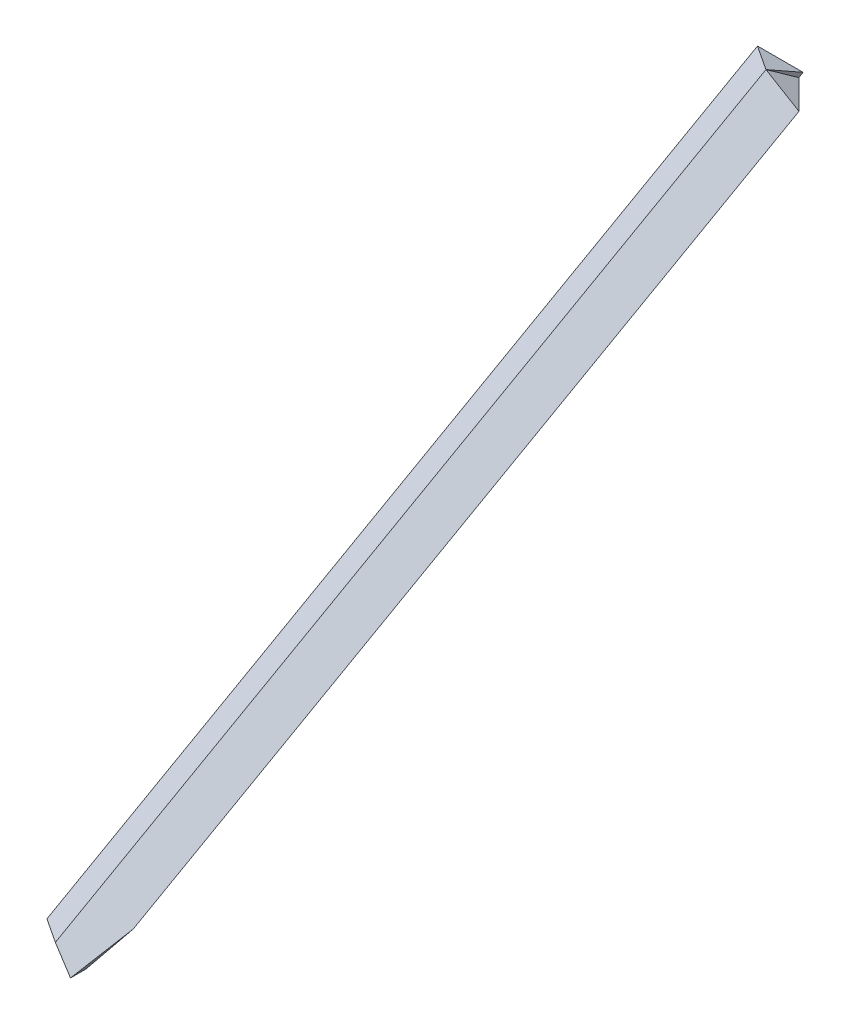
ISO-10303-21;
HEADER;
FILE_DESCRIPTION(('STEP AP214'),'2;1');
FILE_NAME('part.step','',(''),(''),'','','');
FILE_SCHEMA(('AUTOMOTIVE_DESIGN { 1 0 10303 214 1 1 1 1 }'));
ENDSEC;
DATA;
#1=APPLICATION_CONTEXT('core data for automotive mechanical design processes');
#2=APPLICATION_PROTOCOL_DEFINITION('international standard','automotive_design',2000,#1);
#3=PRODUCT_CONTEXT('',#1,'mechanical');
#4=PRODUCT('Part','Part','',(#3));
#5=PRODUCT_RELATED_PRODUCT_CATEGORY('part','',(#4));
#6=PRODUCT_DEFINITION_FORMATION('','',#4);
#7=PRODUCT_DEFINITION_CONTEXT('part definition',#1,'design');
#8=PRODUCT_DEFINITION('design','',#6,#7);
#9=PRODUCT_DEFINITION_SHAPE('','',#8);
#10=(LENGTH_UNIT() NAMED_UNIT(*) SI_UNIT(.MILLI.,.METRE.));
#11=(NAMED_UNIT(*) PLANE_ANGLE_UNIT() SI_UNIT($,.RADIAN.));
#12=(NAMED_UNIT(*) SI_UNIT($,.STERADIAN.) SOLID_ANGLE_UNIT());
#13=UNCERTAINTY_MEASURE_WITH_UNIT(LENGTH_MEASURE(1.E-05),#10,'distance_accuracy_value','');
#14=(GEOMETRIC_REPRESENTATION_CONTEXT(3) GLOBAL_UNCERTAINTY_ASSIGNED_CONTEXT((#13)) GLOBAL_UNIT_ASSIGNED_CONTEXT((#10,
#11,#12)) REPRESENTATION_CONTEXT('',''));
#15=CARTESIAN_POINT('',(0.,0.,0.));
#16=DIRECTION('',(0.,0.,1.));
#17=DIRECTION('',(1.,0.,0.));
#18=AXIS2_PLACEMENT_3D('',#15,#16,#17);
#19=CARTESIAN_POINT('',(252.903016686641,361.646186737307,-51.3842000000199));
#20=DIRECTION('',(-0.599439623726809,0.526033966837768,0.603291308771462));
#21=DIRECTION('',(0.70936761741224,0.,0.704838693153889));
#22=AXIS2_PLACEMENT_3D('',#19,#20,#21);
#23=PLANE('',#22);
#24=DIRECTION('',(0.780329870048942,0.216253771888641,0.586787525475225));
#25=VECTOR('',#24,1.);
#26=CARTESIAN_POINT('',(12.2151255595458,11.1057079121775,15.1149176525535));
#27=LINE('',#26,#25);
#28=CARTESIAN_POINT('',(85.6116867373077,31.4461867373069,70.3072000000032));
#29=VERTEX_POINT('',#28);
#30=CARTESIAN_POINT('',(71.7455888175322,27.6034580508597,59.8802592937195));
#31=VERTEX_POINT('',#30);
#32=EDGE_CURVE('E108',#29,#31,#27,.F.);
#33=ORIENTED_EDGE('',*,*,#32,.F.);
#34=CARTESIAN_POINT('',(252.903016686641,361.646186737307,-51.3842000000199));
#35=CARTESIAN_POINT('',(197.139240036863,251.57952007064,-10.8204000000122));
#36=CARTESIAN_POINT('',(141.375463387085,141.512853403974,29.7433999999955));
#37=CARTESIAN_POINT('',(85.6116867373077,31.4461867373069,70.3072000000032));
#38=B_SPLINE_CURVE_WITH_KNOTS('',3,(#34,#35,#36,#37),.UNSPECIFIED.,.F.,.F.,(4,4),(0.,1.),.UNSPECIFIED.);
#39=CARTESIAN_POINT('',(252.903016686641,361.646186737307,-51.3842000000199));
#40=VERTEX_POINT('',#39);
#41=EDGE_CURVE('E134',#29,#40,#38,.F.);
#42=ORIENTED_EDGE('',*,*,#41,.T.);
#43=DIRECTION('',(0.780329870048942,0.216253771888641,0.586787525475225));
#44=VECTOR('',#43,1.);
#45=CARTESIAN_POINT('',(252.903016686641,361.646186737307,-51.3842000000199));
#46=LINE('',#45,#44);
#47=CARTESIAN_POINT('',(239.036918766865,357.80345805086,-61.8111407063036));
#48=VERTEX_POINT('',#47);
#49=EDGE_CURVE('E136',#48,#40,#46,.T.);
#50=ORIENTED_EDGE('',*,*,#49,.F.);
#51=DIRECTION('',(-0.429337284685995,-0.847426889643666,0.31230940217566));
#52=VECTOR('',#51,1.);
#53=CARTESIAN_POINT('',(241.59286358523,362.848387631368,-63.6703912924742));
#54=LINE('',#53,#52);
#55=EDGE_CURVE('E129',#48,#31,#54,.T.);
#56=ORIENTED_EDGE('',*,*,#55,.T.);
#57=EDGE_LOOP('',(#33,#42,#50,#56));
#58=FACE_BOUND('',#57,.T.);
#59=ADVANCED_FACE('F41',(#58),#23,.T.);
#60=CARTESIAN_POINT('',(-202.216329949319,361.646186737307,-51.3842000000199));
#61=DIRECTION('',(0.,0.345802356485694,0.938307375143637));
#62=DIRECTION('',(0.,-0.938307375143637,0.345802356485694));
#63=AXIS2_PLACEMENT_3D('',#60,#61,#62);
#64=PLANE('',#63);
#65=CARTESIAN_POINT('',(94.3068387159963,24.5265055774754,72.8573686489847));
#66=CARTESIAN_POINT('',(92.8577215480199,25.6798685469874,72.4323100346052));
#67=CARTESIAN_POINT('',(91.4085669647603,26.8331901277958,72.0072666735549));
#68=CARTESIAN_POINT('',(89.2347789699846,28.5631104167612,71.3697245116753));
#69=CARTESIAN_POINT('',(88.5101736171948,29.13974016701,71.1572142706413));
#70=CARTESIAN_POINT('',(87.0609442060382,30.2929789731256,70.7322014152489));
#71=CARTESIAN_POINT('',(86.3363201476714,30.8695880289924,70.5196988008906));
#72=CARTESIAN_POINT('',(85.6116867373077,31.4461867373069,70.3072000000032));
#73=B_SPLINE_CURVE_WITH_KNOTS('',3,(#65,#66,#67,#68,#69,#70,#71,#72),.UNSPECIFIED.,.F.,.F.,(4,2,
2,4),(0.,5.70068011431883,8.55102018105121,11.4013602504243),.UNSPECIFIED.);
#74=CARTESIAN_POINT('',(94.3068387328869,24.5265055640294,72.8573686614481));
#75=VERTEX_POINT('',#74);
#76=EDGE_CURVE('E124',#75,#29,#73,.T.);
#77=ORIENTED_EDGE('',*,*,#76,.F.);
#78=CARTESIAN_POINT('',(94.3068387499259,24.5265055504701,72.8573686589372));
#79=CARTESIAN_POINT('',(95.8849141094393,26.5094885732394,72.1265631464688));
#80=CARTESIAN_POINT('',(97.4629020841278,28.4925328199966,71.395735070606));
#81=CARTESIAN_POINT('',(100.618718991153,32.4587327135383,69.9340378636859));
#82=CARTESIAN_POINT('',(102.196547923491,34.4418883603223,69.2031687326287));
#83=CARTESIAN_POINT('',(105.352062487446,38.4083000239811,67.7413934802753));
#84=CARTESIAN_POINT('',(106.929748119063,40.3915560408559,67.0104873589792));
#85=CARTESIAN_POINT('',(110.084988987867,44.3581594085822,65.5486414563039));
#86=CARTESIAN_POINT('',(111.662544225053,46.3415067594341,64.8177016749245));
#87=CARTESIAN_POINT('',(113.240040710636,48.3248952497502,64.0867467320703));
#88=B_SPLINE_CURVE_WITH_KNOTS('',3,(#78,#79,#80,#81,#82,#83,#84,#85,#86,#87),.UNSPECIFIED.,.F.,
.F.,(4,2,2,2,4),(0.,7.91262167559483,15.8252433143356,23.7378649512406,31.6504866249996),.UNSPECIFIED.);
#89=CARTESIAN_POINT('',(111.755705126176,46.4586721870779,64.7745217084751));
#90=VERTEX_POINT('',#89);
#91=EDGE_CURVE('E140',#75,#90,#88,.T.);
#92=ORIENTED_EDGE('',*,*,#91,.T.);
#93=DIRECTION('',(-0.429337284685995,-0.847426889643666,0.31230940217566));
#94=VECTOR('',#93,1.);
#95=CARTESIAN_POINT('',(214.516371884815,249.287905321749,-9.97585182601687));
#96=LINE('',#95,#94);
#97=CARTESIAN_POINT('',(268.479594429019,355.800634280822,-49.2298890908642));
#98=VERTEX_POINT('',#97);
#99=EDGE_CURVE('E89',#98,#90,#96,.T.);
#100=ORIENTED_EDGE('',*,*,#99,.F.);
#101=DIRECTION('',(0.928491907182555,-0.348442914651976,0.128414615699841));
#102=VECTOR('',#101,1.);
#103=CARTESIAN_POINT('',(252.903016686641,361.646186737307,-51.3842000000199));
#104=LINE('',#103,#102);
#105=EDGE_CURVE('E139',#40,#98,#104,.T.);
#106=ORIENTED_EDGE('',*,*,#105,.F.);
#107=ORIENTED_EDGE('',*,*,#41,.F.);
#108=EDGE_LOOP('',(#77,#92,#100,#106,#107));
#109=FACE_BOUND('',#108,.T.);
#110=ADVANCED_FACE('F138',(#109),#64,.T.);
#111=CARTESIAN_POINT('',(-34.9249999999667,31.4461867373069,70.3072000000032));
#112=DIRECTION('',(0.,0.938307375143637,-0.345802356485694));
#113=DIRECTION('',(-1.,0.,0.));
#114=AXIS2_PLACEMENT_3D('',#111,#112,#113);
#115=PLANE('',#114);
#116=DIRECTION('',(0.38757088722442,-0.318774410874918,-0.864969179998585));
#117=VECTOR('',#116,1.);
#118=CARTESIAN_POINT('',(85.6116867373077,31.4461867373069,70.3072000000032));
#119=LINE('',#118,#117);
#120=CARTESIAN_POINT('',(90.2837360472928,27.6034580508597,59.8802592937195));
#121=VERTEX_POINT('',#120);
#122=EDGE_CURVE('E104',#29,#121,#119,.T.);
#123=ORIENTED_EDGE('',*,*,#122,.F.);
#124=ORIENTED_EDGE('',*,*,#32,.T.);
#125=DIRECTION('',(-1.,0.,0.));
#126=VECTOR('',#125,1.);
#127=CARTESIAN_POINT('',(252.903016686641,27.6034580508597,59.8802592937195));
#128=LINE('',#127,#126);
#129=EDGE_CURVE('E82',#31,#121,#128,.F.);
#130=ORIENTED_EDGE('',*,*,#129,.T.);
#131=EDGE_LOOP('',(#123,#124,#130));
#132=FACE_BOUND('',#131,.T.);
#133=ADVANCED_FACE('F106',(#132),#115,.F.);
#134=CARTESIAN_POINT('',(256.713864792503,356.103617194268,-61.1846839721549));
#135=DIRECTION('',(-0.844325495891824,0.253860668802322,-0.471878393044504));
#136=DIRECTION('',(-0.221600490355852,-0.967240797751645,-0.123848543951101));
#137=AXIS2_PLACEMENT_3D('',#134,#135,#136);
#138=PLANE('',#137);
#139=DIRECTION('',(0.387570887224406,-0.318774410874926,-0.864969179998589));
#140=VECTOR('',#139,1.);
#141=CARTESIAN_POINT('',(252.903016686641,361.646186737307,-51.3842000000199));
#142=LINE('',#141,#140);
#143=CARTESIAN_POINT('',(257.575065996626,357.80345805086,-61.8111407063036));
#144=VERTEX_POINT('',#143);
#145=EDGE_CURVE('E74',#40,#144,#142,.T.);
#146=ORIENTED_EDGE('',*,*,#145,.F.);
#147=DIRECTION('',(0.30754643148726,-0.491552843681101,-0.814733695356019));
#148=VECTOR('',#147,1.);
#149=CARTESIAN_POINT('',(252.903016686641,361.646186737307,-51.3842000000199));
#150=LINE('',#149,#148);
#151=CARTESIAN_POINT('',(256.560362628535,355.800634280822,-61.0730231153612));
#152=VERTEX_POINT('',#151);
#153=EDGE_CURVE('E294',#40,#152,#150,.T.);
#154=ORIENTED_EDGE('',*,*,#153,.T.);
#155=DIRECTION('',(0.429337284685995,0.847426889643666,-0.31230940217566));
#156=VECTOR('',#155,1.);
#157=CARTESIAN_POINT('',(256.713864792503,356.103617194268,-61.1846839721549));
#158=LINE('',#157,#156);
#159=EDGE_CURVE('E306',#152,#144,#158,.T.);
#160=ORIENTED_EDGE('',*,*,#159,.T.);
#161=EDGE_LOOP('',(#146,#154,#160));
#162=FACE_BOUND('',#161,.T.);
#163=ADVANCED_FACE('F172',(#162),#138,.F.);
#164=CARTESIAN_POINT('',(252.903016686641,361.646186737307,-51.3842000000199));
#165=DIRECTION('',(0.,0.938307375143637,-0.345802356485694));
#166=DIRECTION('',(-1.,0.,0.));
#167=AXIS2_PLACEMENT_3D('',#164,#165,#166);
#168=PLANE('',#167);
#169=DIRECTION('',(-1.,0.,0.));
#170=VECTOR('',#169,1.);
#171=CARTESIAN_POINT('',(252.903016686641,357.80345805086,-61.8111407063036));
#172=LINE('',#171,#170);
#173=EDGE_CURVE('E302',#144,#48,#172,.T.);
#174=ORIENTED_EDGE('',*,*,#173,.T.);
#175=ORIENTED_EDGE('',*,*,#49,.T.);
#176=ORIENTED_EDGE('',*,*,#145,.T.);
#177=EDGE_LOOP('',(#174,#175,#176));
#178=FACE_BOUND('',#177,.T.);
#179=ADVANCED_FACE('F173',(#178),#168,.T.);
#180=CARTESIAN_POINT('',(85.6116867373077,31.4461867373069,230.451572510383));
#181=CARTESIAN_POINT('',(85.6116867373077,31.4461867373069,229.905322987356));
#182=CARTESIAN_POINT('',(85.6116867373077,31.4461867373069,229.359073464329));
#183=CARTESIAN_POINT('',(85.6116867373077,31.4461867373069,228.812823941302));
#184=CARTESIAN_POINT('',(85.6116867373077,31.4461867373069,227.488815960862));
#185=CARTESIAN_POINT('',(85.6116867373077,31.4461867373069,226.164807980421));
#186=CARTESIAN_POINT('',(85.6116867373077,31.4461867373069,224.84079999998));
#187=CARTESIAN_POINT('',(85.6116867373077,31.4461867373069,173.329599999988));
#188=CARTESIAN_POINT('',(85.6116867373077,31.4461867373069,121.818399999995));
#189=CARTESIAN_POINT('',(85.6116867373077,31.4461867373069,70.3072000000032));
#190=CARTESIAN_POINT('',(85.6116867373077,31.4461867373069,69.0582967896457));
#191=CARTESIAN_POINT('',(85.6116867373077,31.4461867373069,67.8093935792882));
#192=CARTESIAN_POINT('',(85.6116867373077,31.4461867373069,66.5604903689307));
#193=CARTESIAN_POINT('',(85.6116867373077,31.4461867373069,66.0196492570227));
#194=CARTESIAN_POINT('',(85.6116867373077,31.4461867373069,65.4788081451148));
#195=CARTESIAN_POINT('',(85.6116867373077,31.4461867373069,64.9379670332069));
#196=CARTESIAN_POINT('',(94.2811443606363,24.4943407304016,230.451572510383));
#197=CARTESIAN_POINT('',(94.2812333684707,24.4944517595647,229.905322987356));
#198=CARTESIAN_POINT('',(94.2813223763052,24.4945627887279,229.359073464329));
#199=CARTESIAN_POINT('',(94.2814113841396,24.494673817891,228.812823941302));
#200=CARTESIAN_POINT('',(94.2816271226953,24.4949429320812,227.488815960862));
#201=CARTESIAN_POINT('',(94.281842861251,24.4952120462714,226.164807980421));
#202=CARTESIAN_POINT('',(94.2820585998066,24.4954811604616,224.84079999998));
#203=CARTESIAN_POINT('',(94.2904520174086,24.5059511841163,173.329599999988));
#204=CARTESIAN_POINT('',(94.2988508466847,24.51646681801,121.818399999995));
#205=CARTESIAN_POINT('',(94.3072548008999,24.5270283852068,70.3072000000032));
#206=CARTESIAN_POINT('',(94.307458557081,24.527284453308,69.0582967896457));
#207=CARTESIAN_POINT('',(94.3076623132622,24.5275405214093,67.8093935792882));
#208=CARTESIAN_POINT('',(94.3078660694433,24.5277965895106,66.5604903689307));
#209=CARTESIAN_POINT('',(94.3079543066411,24.5279074805352,66.0196492570227));
#210=CARTESIAN_POINT('',(94.3080425438389,24.5280183715598,65.4788081451148));
#211=CARTESIAN_POINT('',(94.3081307810367,24.5281292625844,64.9379670332069));
#212=B_SPLINE_SURFACE_WITH_KNOTS('',1,3,((#180,#181,#182,#183,#184,#185,#186,#187,#188,#189,
#190,#191,#192,#193,#194,#195),(#196,#197,#198,#199,#200,#201,#202,#203,#204,#205,#206,#207,
#208,#209,#210,#211)),.UNSPECIFIED.,.F.,.F.,.F.,(2,2),(4,3,3,3,3,4),(0.,1.),
(-0.0363077836173099,-0.0257033029795639,0.,1.,1.0242452750151,1.03474476079504),.UNSPECIFIED.);
#213=CARTESIAN_POINT('',(94.3078660355077,24.5277966165087,66.5604903689307));
#214=CARTESIAN_POINT('',(94.3078232303463,24.5277428216471,66.8228602977585));
#215=CARTESIAN_POINT('',(94.3077804251866,24.5276890268001,67.0852302265863));
#216=CARTESIAN_POINT('',(94.307694814867,24.527581437106,67.609970084242));
#217=CARTESIAN_POINT('',(94.3076520097072,24.527527642259,67.8723400130699));
#218=CARTESIAN_POINT('',(94.3075663993844,24.5274200525359,68.3970798707255));
#219=CARTESIAN_POINT('',(94.3075235942214,24.5273662576599,68.6594497995534));
#220=CARTESIAN_POINT('',(94.3074379839083,24.5272586680238,69.184189657209));
#221=CARTESIAN_POINT('',(94.3073951787582,24.5272048732636,69.4465595860369));
#222=CARTESIAN_POINT('',(94.3073095684096,24.5270972833089,69.9712994436925));
#223=CARTESIAN_POINT('',(94.307266763211,24.5270434881144,70.2336693725202));
#224=CARTESIAN_POINT('',(94.3071811530407,24.5269358997585,70.7584092301758));
#225=CARTESIAN_POINT('',(94.307138348069,24.5268821065971,71.0207791590036));
#226=CARTESIAN_POINT('',(94.3070527384015,24.5267745227451,71.5455190166592));
#227=CARTESIAN_POINT('',(94.3070099337056,24.5267207320545,71.8078889454871));
#228=CARTESIAN_POINT('',(94.3069243245798,24.5266131530564,72.3326288031427));
#229=CARTESIAN_POINT('',(94.30688152015,24.5265593647489,72.5949987319706));
#230=CARTESIAN_POINT('',(94.3068387158483,24.5265055775892,72.8573686607987));
#231=B_SPLINE_CURVE_WITH_KNOTS('',3,(#213,#214,#215,#216,#217,#218,#219,#220,#221,#222,#223,
#224,#225,#226,#227,#228,#229,#230),.UNSPECIFIED.,.F.,.F.,(4,2,2,2,2,2,2,2,4),(0.,
0.787109813503559,1.57421962700716,2.36132944051072,3.14843925401426,3.93554906751778,
4.72265888102017,5.50976869452094,6.29687850802014),.UNSPECIFIED.);
#232=CARTESIAN_POINT('',(94.307866078476,24.5277966705184,66.5604903689488));
#233=VERTEX_POINT('',#232);
#234=EDGE_CURVE('E54',#233,#75,#231,.T.);
#235=CARTESIAN_POINT('',(85.6116867373077,31.4461867373069,70.3072000000032));
#236=CARTESIAN_POINT('',(85.9740020161228,31.1578885181252,70.1510868825518));
#237=CARTESIAN_POINT('',(86.3363204786321,30.8695943000125,69.9949737651003));
#238=CARTESIAN_POINT('',(87.0609637710391,30.2930138659251,69.6827475301974));
#239=CARTESIAN_POINT('',(87.4232886009369,30.0047276499504,69.5266344127459));
#240=CARTESIAN_POINT('',(88.1479446281209,29.428163220139,69.2144081778431));
#241=CARTESIAN_POINT('',(88.5102758254071,29.1398850063023,69.0582950603917));
#242=CARTESIAN_POINT('',(89.2349445873681,28.5633365807668,68.7460688254888));
#243=CARTESIAN_POINT('',(89.5972821520428,28.2750663690681,68.5899557080373));
#244=CARTESIAN_POINT('',(90.3219636487807,27.6985339478086,68.2777294731344));
#245=CARTESIAN_POINT('',(90.6843075808439,27.4102717382478,68.121616355683));
#246=CARTESIAN_POINT('',(91.4090018123587,26.8337553212643,67.8093901207801));
#247=CARTESIAN_POINT('',(91.7713521118104,26.5455011138415,67.6532770033287));
#248=CARTESIAN_POINT('',(92.4960590781021,25.969000701134,67.3410507684258));
#249=CARTESIAN_POINT('',(92.8584157449423,25.6807544958492,67.1849376509743));
#250=CARTESIAN_POINT('',(93.583135446011,25.1042700874176,66.8727114160715));
#251=CARTESIAN_POINT('',(93.9454984802396,24.8160318842707,66.71659829862));
#252=CARTESIAN_POINT('',(94.3078646975276,24.5277976826979,66.5604851814421));
#253=B_SPLINE_CURVE_WITH_KNOTS('',3,(#235,#236,#237,#238,#239,#240,#241,#242,#243,#244,#245,
#246,#247,#248,#249,#250,#251,#252),.UNSPECIFIED.,.F.,.F.,(4,2,2,2,2,2,2,2,4),(0.,
1.46589077659307,2.93178155382823,4.39767233234749,5.86356311279298,7.32945389580672,
8.7953446820308,10.2612354721073,11.7271262666783),.UNSPECIFIED.);
#254=EDGE_CURVE('E112',#29,#233,#253,.T.);
#255=ORIENTED_EDGE('',*,*,#234,.T.);
#256=ORIENTED_EDGE('',*,*,#76,.T.);
#257=ORIENTED_EDGE('',*,*,#254,.T.);
#258=EDGE_LOOP('',(#255,#256,#257));
#259=FACE_BOUND('',#258,.T.);
#260=ADVANCED_FACE('F125',(#259),#212,.F.);
#261=CARTESIAN_POINT('',(252.903016686641,357.80345805086,-61.8111407063036));
#262=DIRECTION('',(0.,0.345802356485694,0.938307375143637));
#263=DIRECTION('',(-1.,0.,0.));
#264=AXIS2_PLACEMENT_3D('',#261,#262,#263);
#265=PLANE('',#264);
#266=ORIENTED_EDGE('',*,*,#55,.F.);
#267=ORIENTED_EDGE('',*,*,#173,.F.);
#268=ORIENTED_EDGE('',*,*,#159,.F.);
#269=DIRECTION('',(0.429337284685995,0.847426889643666,-0.31230940217566));
#270=VECTOR('',#269,1.);
#271=CARTESIAN_POINT('',(256.713864792503,356.103617194268,-61.1846839721549));
#272=LINE('',#271,#270);
#273=EDGE_CURVE('E293',#121,#152,#272,.T.);
#274=ORIENTED_EDGE('',*,*,#273,.F.);
#275=ORIENTED_EDGE('',*,*,#129,.F.);
#276=EDGE_LOOP('',(#266,#267,#268,#274,#275));
#277=FACE_BOUND('',#276,.T.);
#278=ADVANCED_FACE('F179',(#277),#265,.F.);
#279=CARTESIAN_POINT('',(-12.2525796471323,105.972443103538,-110.334489517473));
#280=DIRECTION('',(-0.619432904565099,-0.784961868122526,0.0117363680770162));
#281=DIRECTION('',(0.00727039330471242,0.00921323595887986,0.999931126460398));
#282=AXIS2_PLACEMENT_3D('',#279,#280,#281);
#283=PLANE('',#282);
#284=ORIENTED_EDGE('',*,*,#254,.F.);
#285=ORIENTED_EDGE('',*,*,#122,.T.);
#286=DIRECTION('',(-0.480020548321571,0.366881947353185,-0.796855011840544));
#287=VECTOR('',#286,1.);
#288=CARTESIAN_POINT('',(-12.2525796471323,105.972443103538,-110.334489517473));
#289=LINE('',#288,#287);
#290=EDGE_CURVE('E117',#233,#121,#289,.T.);
#291=ORIENTED_EDGE('',*,*,#290,.F.);
#292=EDGE_LOOP('',(#284,#285,#291));
#293=FACE_BOUND('',#292,.T.);
#294=ADVANCED_FACE('F116',(#293),#283,.T.);
#295=CARTESIAN_POINT('',(85.6116867373077,31.4461867373069,233.752678933035));
#296=CARTESIAN_POINT('',(85.6116867373077,31.4461867373069,231.302315742016));
#297=CARTESIAN_POINT('',(85.6116867373077,31.4461867373069,228.851952550998));
#298=CARTESIAN_POINT('',(85.6116867373077,31.4461867373069,225.88132623998));
#299=CARTESIAN_POINT('',(85.6116867373077,31.4461867373069,225.36106311998));
#300=CARTESIAN_POINT('',(85.6116867373077,31.4461867373069,173.329599999988));
#301=CARTESIAN_POINT('',(85.6116867373077,31.4461867373069,121.818399999995));
#302=CARTESIAN_POINT('',(85.6116867373077,31.4461867373069,69.7920880000032));
#303=CARTESIAN_POINT('',(85.6116867373077,31.4461867373069,69.2769760000033));
#304=CARTESIAN_POINT('',(85.6116867373077,31.4461867373069,68.0280727896519));
#305=CARTESIAN_POINT('',(85.6116867373077,31.4461867373069,67.2942815793003));
#306=CARTESIAN_POINT('',(85.6116867373077,31.4461867373069,66.5604903689488));
#307=CARTESIAN_POINT('',(173.885697576411,141.512853403974,332.101815142198));
#308=CARTESIAN_POINT('',(173.875311712088,141.512853403974,328.042838800621));
#309=CARTESIAN_POINT('',(173.864925847764,141.512853403974,323.983862459044));
#310=CARTESIAN_POINT('',(173.852334848219,141.512853403974,319.0630809356));
#311=CARTESIAN_POINT('',(173.850129712998,141.512853403974,318.201275753733));
#312=CARTESIAN_POINT('',(173.62959435787,141.512853403974,232.012224842495));
#313=CARTESIAN_POINT('',(173.411264137963,141.512853403974,146.684979113124));
#314=CARTESIAN_POINT('',(173.190750615857,141.512853403974,60.5044609264588));
#315=CARTESIAN_POINT('',(173.188567313658,141.512853403974,59.6511884691651));
#316=CARTESIAN_POINT('',(173.183273837433,141.512853403974,57.5824059301857));
#317=CARTESIAN_POINT('',(173.180163663406,141.512853403974,56.3668958485001));
#318=CARTESIAN_POINT('',(173.177053489379,141.512853403974,55.1513857668144));
#319=CARTESIAN_POINT('',(262.159708415515,251.57952007064,430.450951351362));
#320=CARTESIAN_POINT('',(262.138936686868,251.57952007064,424.783361859226));
#321=CARTESIAN_POINT('',(262.11816495822,251.57952007064,419.115772367089));
#322=CARTESIAN_POINT('',(262.092982959131,251.57952007064,412.24483563122));
#323=CARTESIAN_POINT('',(262.088572688689,251.57952007064,411.041488387486));
#324=CARTESIAN_POINT('',(261.647501978433,251.57952007064,290.694849685003));
#325=CARTESIAN_POINT('',(261.210841538619,251.57952007064,171.551558226252));
#326=CARTESIAN_POINT('',(260.769814494407,251.57952007064,51.2168338529143));
#327=CARTESIAN_POINT('',(260.765447890009,251.57952007064,50.0254009383268));
#328=CARTESIAN_POINT('',(260.754860937557,251.57952007064,47.1367390707195));
#329=CARTESIAN_POINT('',(260.748640589504,251.57952007064,45.4395101176997));
#330=CARTESIAN_POINT('',(260.742420241451,251.57952007064,43.7422811646799));
#331=CARTESIAN_POINT('',(350.433719254618,361.646186737307,528.800087560526));
#332=CARTESIAN_POINT('',(350.402561661647,361.646186737307,521.523884917831));
#333=CARTESIAN_POINT('',(350.371404068677,361.646186737307,514.247682275135));
#334=CARTESIAN_POINT('',(350.333631070043,361.646186737307,505.42659032684));
#335=CARTESIAN_POINT('',(350.32701566438,361.646186737307,503.88170102124));
#336=CARTESIAN_POINT('',(349.665409598995,361.646186737307,349.37747452751));
#337=CARTESIAN_POINT('',(349.010418939275,361.646186737307,196.418137339381));
#338=CARTESIAN_POINT('',(348.348878372957,361.646186737307,41.9292067793699));
#339=CARTESIAN_POINT('',(348.342328466359,361.646186737307,40.3996134074886));
#340=CARTESIAN_POINT('',(348.326448037682,361.646186737307,36.6910722112533));
#341=CARTESIAN_POINT('',(348.317117515602,361.646186737307,34.5121243868994));
#342=CARTESIAN_POINT('',(348.307786993522,361.646186737307,32.3331765625454));
#343=B_SPLINE_SURFACE_WITH_KNOTS('',3,3,((#295,#296,#297,#298,#299,#300,#301,#302,#303,#304,
#305,#306),(#307,#308,#309,#310,#311,#312,#313,#314,#315,#316,#317,#318),(#319,#320,#321,#322,
#323,#324,#325,#326,#327,#328,#329,#330),(#331,#332,#333,#334,#335,#336,#337,#338,#339,#340,
#341,#342)),.UNSPECIFIED.,.F.,.F.,.F.,(4,4),(4,2,2,2,2,4),(0.,1.),(-0.0576695225702109,-0.0101,
0.,1.,1.01,1.02424527501498),.UNSPECIFIED.);
#344=OFFSET_SURFACE('',#343,-11.1125,.F.);
#345=ORIENTED_EDGE('',*,*,#91,.F.);
#346=ORIENTED_EDGE('',*,*,#234,.F.);
#347=CARTESIAN_POINT('',(439.481749549281,458.342783121959,31.2698852183139));
#348=CARTESIAN_POINT('',(421.651769195454,435.934853576197,33.0921149392469));
#349=CARTESIAN_POINT('',(403.821803756336,413.526914073709,34.9143681613373));
#350=CARTESIAN_POINT('',(368.16192598726,368.71099961293,38.5589582909445));
#351=CARTESIAN_POINT('',(350.332013657301,346.303024654641,40.3812951984613));
#352=CARTESIAN_POINT('',(314.672265387179,301.487023741035,44.0260893819411));
#353=CARTESIAN_POINT('',(296.842429447015,279.078997785719,45.8485466579041));
#354=CARTESIAN_POINT('',(261.182878376197,234.262865231575,49.4936515643607));
#355=CARTESIAN_POINT('',(243.353163245542,211.854758632746,51.3162991948542));
#356=CARTESIAN_POINT('',(213.637147017821,174.507797046397,54.3543220202331));
#357=CARTESIAN_POINT('',(201.750787368,159.568981143211,55.5696049569863));
#358=CARTESIAN_POINT('',(177.97821394508,129.691251974093,58.0004006703689));
#359=CARTESIAN_POINT('',(166.092000171981,114.75233870816,59.2159134469983));
#360=CARTESIAN_POINT('',(142.319810513717,84.8743533842317,61.6473138265957));
#361=CARTESIAN_POINT('',(130.433834628552,69.9352813262353,62.863201429564));
#362=CARTESIAN_POINT('',(112.605200244297,47.526453374217,64.6875518833531));
#363=CARTESIAN_POINT('',(106.662377020913,40.0568074095057,65.2957552097663));
#364=CARTESIAN_POINT('',(94.7768969093762,25.1174044842014,66.5124239176383));
#365=CARTESIAN_POINT('',(88.8342400212225,17.6476475236082,67.1208892990972));
#366=CARTESIAN_POINT('',(82.8916945629492,10.1778162136915,67.7295302271844));
#367=B_SPLINE_CURVE_WITH_KNOTS('',3,(#347,#348,#349,#350,#351,#352,#353,#354,#355,#356,#357,
#358,#359,#360,#361,#362,#363,#364,#365,#366),.UNSPECIFIED.,.F.,.F.,(4,2,2,2,2,2,2,2,2,4),(0.,
86.081915893874,172.163831793953,258.245747702131,344.327663607886,401.715607552604,
459.10355148118,516.491495448903,545.185467457359,573.879439479086),.UNSPECIFIED.);
#368=EDGE_CURVE('E62',#90,#233,#367,.T.);
#369=ORIENTED_EDGE('',*,*,#368,.F.);
#370=EDGE_LOOP('',(#345,#346,#369));
#371=FACE_BOUND('',#370,.T.);
#372=ADVANCED_FACE('F160',(#371),#344,.F.);
#373=CARTESIAN_POINT('',(252.903016686641,361.646186737307,-51.3842000000198));
#374=DIRECTION('',(0.370769093740489,0.850463559320987,-0.373151461733617));
#375=DIRECTION('',(0.70936761741224,0.,0.704838693153889));
#376=AXIS2_PLACEMENT_3D('',#373,#374,#375);
#377=PLANE('',#376);
#378=ORIENTED_EDGE('',*,*,#153,.F.);
#379=ORIENTED_EDGE('',*,*,#105,.T.);
#380=DIRECTION('',(-0.70936761741224,0.,-0.704838693153889));
#381=VECTOR('',#380,1.);
#382=CARTESIAN_POINT('',(157.994453360148,355.800634280822,-159.009642962333));
#383=LINE('',#382,#381);
#384=EDGE_CURVE('E11',#152,#98,#383,.F.);
#385=ORIENTED_EDGE('',*,*,#384,.F.);
#386=EDGE_LOOP('',(#378,#379,#385));
#387=FACE_BOUND('',#386,.T.);
#388=ADVANCED_FACE('F271',(#387),#377,.T.);
#389=CARTESIAN_POINT('',(116.118786520361,259.746973739116,-116.864905021275));
#390=DIRECTION('',(0.599439623726809,-0.526033966837768,-0.603291308771462));
#391=DIRECTION('',(-0.70936761741224,0.,-0.704838693153889));
#392=AXIS2_PLACEMENT_3D('',#389,#390,#391);
#393=PLANE('',#392);
#394=ORIENTED_EDGE('',*,*,#384,.T.);
#395=ORIENTED_EDGE('',*,*,#99,.T.);
#396=ORIENTED_EDGE('',*,*,#368,.T.);
#397=ORIENTED_EDGE('',*,*,#290,.T.);
#398=ORIENTED_EDGE('',*,*,#273,.T.);
#399=EDGE_LOOP('',(#394,#395,#396,#397,#398));
#400=FACE_BOUND('',#399,.T.);
#401=ADVANCED_FACE('F43',(#400),#393,.T.);
#402=CLOSED_SHELL('',(#59,#110,#133,#163,#179,#260,#278,#294,#372,#388,#401));
#403=MANIFOLD_SOLID_BREP('B2',#402);
#404=ADVANCED_BREP_SHAPE_REPRESENTATION('',(#18,#403),#14);
#405=SHAPE_DEFINITION_REPRESENTATION(#9,#404);
ENDSEC;
END-ISO-10303-21;
